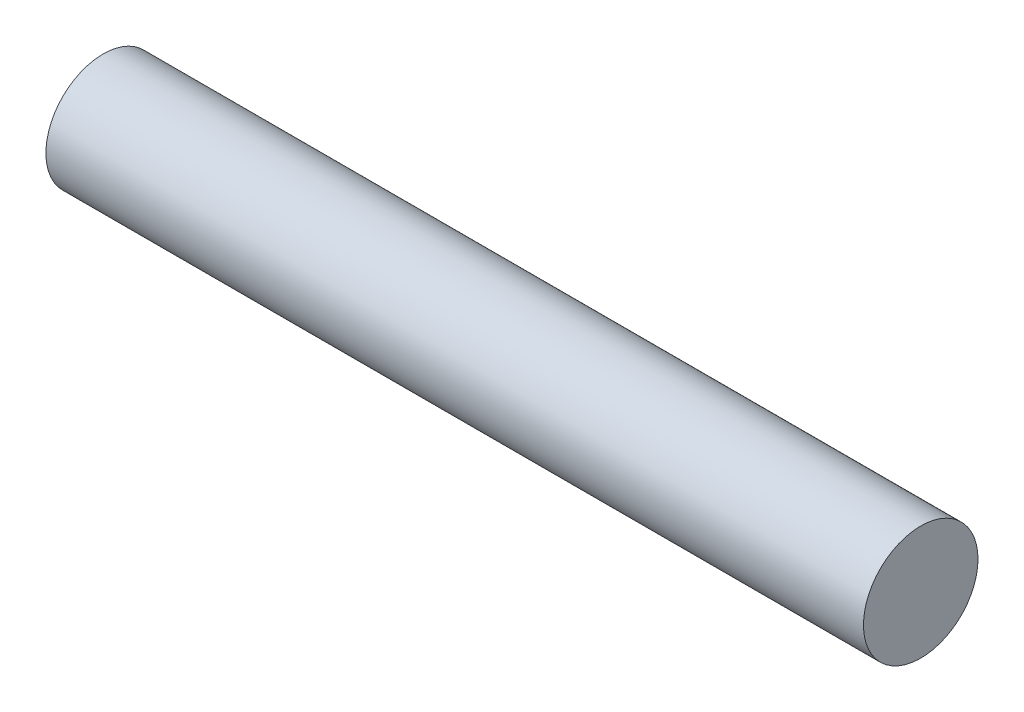
ISO-10303-21;
HEADER;
FILE_DESCRIPTION(('STEP AP214'),'2;1');
FILE_NAME('part.step','',(''),(''),'','','');
FILE_SCHEMA(('AUTOMOTIVE_DESIGN { 1 0 10303 214 1 1 1 1 }'));
ENDSEC;
DATA;
#1=APPLICATION_CONTEXT('core data for automotive mechanical design processes');
#2=APPLICATION_PROTOCOL_DEFINITION('international standard','automotive_design',2000,#1);
#3=PRODUCT_CONTEXT('',#1,'mechanical');
#4=PRODUCT('Part','Part','',(#3));
#5=PRODUCT_RELATED_PRODUCT_CATEGORY('part','',(#4));
#6=PRODUCT_DEFINITION_FORMATION('','',#4);
#7=PRODUCT_DEFINITION_CONTEXT('part definition',#1,'design');
#8=PRODUCT_DEFINITION('design','',#6,#7);
#9=PRODUCT_DEFINITION_SHAPE('','',#8);
#10=(LENGTH_UNIT() NAMED_UNIT(*) SI_UNIT(.MILLI.,.METRE.));
#11=(NAMED_UNIT(*) PLANE_ANGLE_UNIT() SI_UNIT($,.RADIAN.));
#12=(NAMED_UNIT(*) SI_UNIT($,.STERADIAN.) SOLID_ANGLE_UNIT());
#13=UNCERTAINTY_MEASURE_WITH_UNIT(LENGTH_MEASURE(1.E-05),#10,'distance_accuracy_value','');
#14=(GEOMETRIC_REPRESENTATION_CONTEXT(3) GLOBAL_UNCERTAINTY_ASSIGNED_CONTEXT((#13)) GLOBAL_UNIT_ASSIGNED_CONTEXT((#10,
#11,#12)) REPRESENTATION_CONTEXT('',''));
#15=CARTESIAN_POINT('',(0.,0.,0.));
#16=DIRECTION('',(0.,0.,1.));
#17=DIRECTION('',(1.,0.,0.));
#18=AXIS2_PLACEMENT_3D('',#15,#16,#17);
#19=CARTESIAN_POINT('',(159.131,0.,0.));
#20=DIRECTION('',(-1.,0.,0.));
#21=DIRECTION('',(0.,0.,1.));
#22=AXIS2_PLACEMENT_3D('',#19,#20,#21);
#23=CYLINDRICAL_SURFACE('',#22,22.292818);
#24=CARTESIAN_POINT('',(159.131,0.,0.));
#25=DIRECTION('',(1.,0.,0.));
#26=DIRECTION('',(0.,0.,-1.));
#27=AXIS2_PLACEMENT_3D('',#24,#25,#26);
#28=CIRCLE('',#27,22.292818);
#29=CARTESIAN_POINT('',(159.131,0.,-22.292818));
#30=VERTEX_POINT('',#29);
#31=EDGE_CURVE('E10',#30,#30,#28,.T.);
#32=ORIENTED_EDGE('',*,*,#31,.F.);
#33=EDGE_LOOP('',(#32));
#34=FACE_BOUND('',#33,.T.);
#35=CARTESIAN_POINT('',(-159.131,0.,0.));
#36=DIRECTION('',(1.,0.,0.));
#37=DIRECTION('',(0.,0.,-1.));
#38=AXIS2_PLACEMENT_3D('',#35,#36,#37);
#39=CIRCLE('',#38,22.292818);
#40=CARTESIAN_POINT('',(-159.131,0.,-22.292818));
#41=VERTEX_POINT('',#40);
#42=EDGE_CURVE('E37',#41,#41,#39,.T.);
#43=ORIENTED_EDGE('',*,*,#42,.T.);
#44=EDGE_LOOP('',(#43));
#45=FACE_BOUND('',#44,.T.);
#46=ADVANCED_FACE('F31',(#34,#45),#23,.T.);
#47=CARTESIAN_POINT('',(159.131,0.,0.));
#48=DIRECTION('',(1.,0.,0.));
#49=DIRECTION('',(0.,0.,-1.));
#50=AXIS2_PLACEMENT_3D('',#47,#48,#49);
#51=PLANE('',#50);
#52=ORIENTED_EDGE('',*,*,#31,.T.);
#53=EDGE_LOOP('',(#52));
#54=FACE_BOUND('',#53,.T.);
#55=ADVANCED_FACE('F46',(#54),#51,.T.);
#56=CARTESIAN_POINT('',(-159.131,0.,0.));
#57=DIRECTION('',(1.,0.,0.));
#58=DIRECTION('',(0.,0.,-1.));
#59=AXIS2_PLACEMENT_3D('',#56,#57,#58);
#60=PLANE('',#59);
#61=ORIENTED_EDGE('',*,*,#42,.F.);
#62=EDGE_LOOP('',(#61));
#63=FACE_BOUND('',#62,.T.);
#64=ADVANCED_FACE('F44',(#63),#60,.F.);
#65=CLOSED_SHELL('',(#46,#55,#64));
#66=MANIFOLD_SOLID_BREP('B2',#65);
#67=ADVANCED_BREP_SHAPE_REPRESENTATION('',(#18,#66),#14);
#68=SHAPE_DEFINITION_REPRESENTATION(#9,#67);
ENDSEC;
END-ISO-10303-21;
